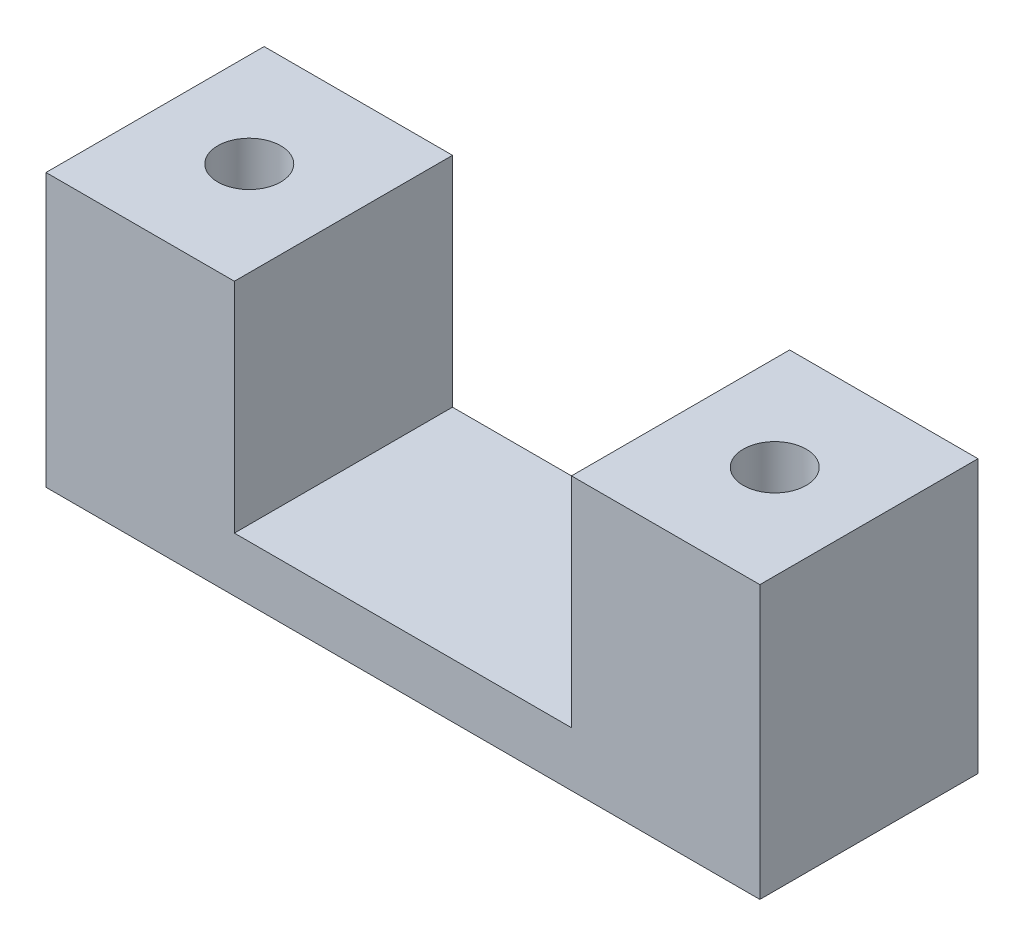
ISO-10303-21;
HEADER;
FILE_DESCRIPTION(('STEP AP214'),'2;1');
FILE_NAME('part.step','',(''),(''),'','','');
FILE_SCHEMA(('AUTOMOTIVE_DESIGN { 1 0 10303 214 1 1 1 1 }'));
ENDSEC;
DATA;
#1=APPLICATION_CONTEXT('core data for automotive mechanical design processes');
#2=APPLICATION_PROTOCOL_DEFINITION('international standard','automotive_design',2000,#1);
#3=PRODUCT_CONTEXT('',#1,'mechanical');
#4=PRODUCT('Part','Part','',(#3));
#5=PRODUCT_RELATED_PRODUCT_CATEGORY('part','',(#4));
#6=PRODUCT_DEFINITION_FORMATION('','',#4);
#7=PRODUCT_DEFINITION_CONTEXT('part definition',#1,'design');
#8=PRODUCT_DEFINITION('design','',#6,#7);
#9=PRODUCT_DEFINITION_SHAPE('','',#8);
#10=(LENGTH_UNIT() NAMED_UNIT(*) SI_UNIT(.MILLI.,.METRE.));
#11=(NAMED_UNIT(*) PLANE_ANGLE_UNIT() SI_UNIT($,.RADIAN.));
#12=(NAMED_UNIT(*) SI_UNIT($,.STERADIAN.) SOLID_ANGLE_UNIT());
#13=UNCERTAINTY_MEASURE_WITH_UNIT(LENGTH_MEASURE(1.E-05),#10,'distance_accuracy_value','');
#14=(GEOMETRIC_REPRESENTATION_CONTEXT(3) GLOBAL_UNCERTAINTY_ASSIGNED_CONTEXT((#13)) GLOBAL_UNIT_ASSIGNED_CONTEXT((#10,
#11,#12)) REPRESENTATION_CONTEXT('',''));
#15=CARTESIAN_POINT('',(0.,0.,0.));
#16=DIRECTION('',(0.,0.,1.));
#17=DIRECTION('',(1.,0.,0.));
#18=AXIS2_PLACEMENT_3D('',#15,#16,#17);
#19=CARTESIAN_POINT('',(9.49999999999999,-41.5,-11.));
#20=DIRECTION('',(0.,1.,0.));
#21=DIRECTION('',(0.,0.,1.));
#22=AXIS2_PLACEMENT_3D('',#19,#20,#21);
#23=CYLINDRICAL_SURFACE('',#22,3.175);
#24=CARTESIAN_POINT('',(9.49999999999999,27.5,-11.));
#25=DIRECTION('',(0.,1.,0.));
#26=DIRECTION('',(0.,0.,1.));
#27=AXIS2_PLACEMENT_3D('',#24,#25,#26);
#28=CIRCLE('',#27,3.175);
#29=CARTESIAN_POINT('',(9.49999999999999,27.5,-7.825));
#30=VERTEX_POINT('',#29);
#31=EDGE_CURVE('E139',#30,#30,#28,.T.);
#32=ORIENTED_EDGE('',*,*,#31,.T.);
#33=EDGE_LOOP('',(#32));
#34=FACE_BOUND('',#33,.T.);
#35=CARTESIAN_POINT('',(9.49999999999999,5.5,-11.));
#36=DIRECTION('',(0.,-1.,0.));
#37=DIRECTION('',(0.,0.,-1.));
#38=AXIS2_PLACEMENT_3D('',#35,#36,#37);
#39=CIRCLE('',#38,3.175);
#40=CARTESIAN_POINT('',(9.49999999999999,5.5,-14.175));
#41=VERTEX_POINT('',#40);
#42=EDGE_CURVE('E171',#41,#41,#39,.F.);
#43=ORIENTED_EDGE('',*,*,#42,.F.);
#44=EDGE_LOOP('',(#43));
#45=FACE_BOUND('',#44,.T.);
#46=ADVANCED_FACE('F34',(#34,#45),#23,.F.);
#47=CARTESIAN_POINT('',(0.,27.5,0.));
#48=DIRECTION('',(0.,1.,0.));
#49=DIRECTION('',(0.,0.,1.));
#50=AXIS2_PLACEMENT_3D('',#47,#48,#49);
#51=PLANE('',#50);
#52=CARTESIAN_POINT('',(62.5,27.5,-11.));
#53=DIRECTION('',(0.,1.,0.));
#54=DIRECTION('',(0.,0.,-1.));
#55=AXIS2_PLACEMENT_3D('',#52,#53,#54);
#56=CIRCLE('',#55,3.17500000000002);
#57=CARTESIAN_POINT('',(62.5,27.5,-14.175));
#58=VERTEX_POINT('',#57);
#59=EDGE_CURVE('E173',#58,#58,#56,.T.);
#60=ORIENTED_EDGE('',*,*,#59,.F.);
#61=EDGE_LOOP('',(#60));
#62=FACE_BOUND('',#61,.T.);
#63=DIRECTION('',(0.,0.,-1.));
#64=VECTOR('',#63,1.);
#65=CARTESIAN_POINT('',(53.,27.5,-22.));
#66=LINE('',#65,#64);
#67=CARTESIAN_POINT('',(53.,27.5,0.));
#68=VERTEX_POINT('',#67);
#69=CARTESIAN_POINT('',(53.,27.5,-22.));
#70=VERTEX_POINT('',#69);
#71=EDGE_CURVE('E115',#68,#70,#66,.T.);
#72=ORIENTED_EDGE('',*,*,#71,.F.);
#73=DIRECTION('',(1.,0.,0.));
#74=VECTOR('',#73,1.);
#75=CARTESIAN_POINT('',(0.,27.5,0.));
#76=LINE('',#75,#74);
#77=CARTESIAN_POINT('',(72.,27.5,0.));
#78=VERTEX_POINT('',#77);
#79=EDGE_CURVE('E87',#68,#78,#76,.T.);
#80=ORIENTED_EDGE('',*,*,#79,.T.);
#81=DIRECTION('',(0.,0.,-1.));
#82=VECTOR('',#81,1.);
#83=CARTESIAN_POINT('',(72.,27.5,0.));
#84=LINE('',#83,#82);
#85=CARTESIAN_POINT('',(72.,27.5,-22.));
#86=VERTEX_POINT('',#85);
#87=EDGE_CURVE('E151',#78,#86,#84,.T.);
#88=ORIENTED_EDGE('',*,*,#87,.T.);
#89=DIRECTION('',(1.,0.,0.));
#90=VECTOR('',#89,1.);
#91=CARTESIAN_POINT('',(0.,27.5,-22.));
#92=LINE('',#91,#90);
#93=EDGE_CURVE('E153',#70,#86,#92,.T.);
#94=ORIENTED_EDGE('',*,*,#93,.F.);
#95=EDGE_LOOP('',(#72,#80,#88,#94));
#96=FACE_BOUND('',#95,.T.);
#97=ADVANCED_FACE('F200',(#62,#96),#51,.T.);
#98=CARTESIAN_POINT('',(0.,27.5,0.));
#99=DIRECTION('',(0.,0.,-1.));
#100=DIRECTION('',(-1.,0.,0.));
#101=AXIS2_PLACEMENT_3D('',#98,#99,#100);
#102=PLANE('',#101);
#103=ORIENTED_EDGE('',*,*,#79,.F.);
#104=DIRECTION('',(0.,1.,0.));
#105=VECTOR('',#104,1.);
#106=CARTESIAN_POINT('',(53.,5.5,0.));
#107=LINE('',#106,#105);
#108=CARTESIAN_POINT('',(53.,5.5,0.));
#109=VERTEX_POINT('',#108);
#110=EDGE_CURVE('E141',#109,#68,#107,.T.);
#111=ORIENTED_EDGE('',*,*,#110,.F.);
#112=DIRECTION('',(1.,0.,0.));
#113=VECTOR('',#112,1.);
#114=CARTESIAN_POINT('',(19.,5.5,0.));
#115=LINE('',#114,#113);
#116=CARTESIAN_POINT('',(19.,5.5,0.));
#117=VERTEX_POINT('',#116);
#118=EDGE_CURVE('E119',#117,#109,#115,.T.);
#119=ORIENTED_EDGE('',*,*,#118,.F.);
#120=DIRECTION('',(0.,1.,0.));
#121=VECTOR('',#120,1.);
#122=CARTESIAN_POINT('',(19.,5.5,0.));
#123=LINE('',#122,#121);
#124=CARTESIAN_POINT('',(19.,27.5,0.));
#125=VERTEX_POINT('',#124);
#126=EDGE_CURVE('E144',#117,#125,#123,.T.);
#127=ORIENTED_EDGE('',*,*,#126,.T.);
#128=CARTESIAN_POINT('',(0.,27.5,0.));
#129=VERTEX_POINT('',#128);
#130=EDGE_CURVE('E148',#129,#125,#76,.T.);
#131=ORIENTED_EDGE('',*,*,#130,.F.);
#132=DIRECTION('',(0.,-1.,0.));
#133=VECTOR('',#132,1.);
#134=CARTESIAN_POINT('',(0.,27.5,0.));
#135=LINE('',#134,#133);
#136=CARTESIAN_POINT('',(0.,0.,0.));
#137=VERTEX_POINT('',#136);
#138=EDGE_CURVE('E60',#129,#137,#135,.T.);
#139=ORIENTED_EDGE('',*,*,#138,.T.);
#140=DIRECTION('',(1.,0.,0.));
#141=VECTOR('',#140,1.);
#142=CARTESIAN_POINT('',(0.,0.,0.));
#143=LINE('',#142,#141);
#144=CARTESIAN_POINT('',(72.,0.,0.));
#145=VERTEX_POINT('',#144);
#146=EDGE_CURVE('E143',#137,#145,#143,.T.);
#147=ORIENTED_EDGE('',*,*,#146,.T.);
#148=DIRECTION('',(0.,-1.,0.));
#149=VECTOR('',#148,1.);
#150=CARTESIAN_POINT('',(72.,27.5,0.));
#151=LINE('',#150,#149);
#152=EDGE_CURVE('E11',#78,#145,#151,.T.);
#153=ORIENTED_EDGE('',*,*,#152,.F.);
#154=EDGE_LOOP('',(#103,#111,#119,#127,#131,#139,#147,#153));
#155=FACE_BOUND('',#154,.T.);
#156=ADVANCED_FACE('F36',(#155),#102,.F.);
#157=CARTESIAN_POINT('',(72.,27.5,0.));
#158=DIRECTION('',(-1.,0.,0.));
#159=DIRECTION('',(0.,0.,1.));
#160=AXIS2_PLACEMENT_3D('',#157,#158,#159);
#161=PLANE('',#160);
#162=DIRECTION('',(0.,0.,-1.));
#163=VECTOR('',#162,1.);
#164=CARTESIAN_POINT('',(72.,0.,0.));
#165=LINE('',#164,#163);
#166=CARTESIAN_POINT('',(72.,0.,-22.));
#167=VERTEX_POINT('',#166);
#168=EDGE_CURVE('E159',#145,#167,#165,.T.);
#169=ORIENTED_EDGE('',*,*,#168,.T.);
#170=DIRECTION('',(0.,-1.,0.));
#171=VECTOR('',#170,1.);
#172=CARTESIAN_POINT('',(72.,27.5,-22.));
#173=LINE('',#172,#171);
#174=EDGE_CURVE('E43',#86,#167,#173,.T.);
#175=ORIENTED_EDGE('',*,*,#174,.F.);
#176=ORIENTED_EDGE('',*,*,#87,.F.);
#177=ORIENTED_EDGE('',*,*,#152,.T.);
#178=EDGE_LOOP('',(#169,#175,#176,#177));
#179=FACE_BOUND('',#178,.T.);
#180=ADVANCED_FACE('F207',(#179),#161,.F.);
#181=CARTESIAN_POINT('',(0.,27.5,-22.));
#182=DIRECTION('',(0.,0.,-1.));
#183=DIRECTION('',(-1.,0.,0.));
#184=AXIS2_PLACEMENT_3D('',#181,#182,#183);
#185=PLANE('',#184);
#186=DIRECTION('',(0.,1.,0.));
#187=VECTOR('',#186,1.);
#188=CARTESIAN_POINT('',(53.,5.5,-22.));
#189=LINE('',#188,#187);
#190=CARTESIAN_POINT('',(53.,5.5,-22.));
#191=VERTEX_POINT('',#190);
#192=EDGE_CURVE('E110',#191,#70,#189,.T.);
#193=ORIENTED_EDGE('',*,*,#192,.T.);
#194=ORIENTED_EDGE('',*,*,#93,.T.);
#195=ORIENTED_EDGE('',*,*,#174,.T.);
#196=DIRECTION('',(1.,0.,0.));
#197=VECTOR('',#196,1.);
#198=CARTESIAN_POINT('',(0.,0.,-22.));
#199=LINE('',#198,#197);
#200=CARTESIAN_POINT('',(0.,0.,-22.));
#201=VERTEX_POINT('',#200);
#202=EDGE_CURVE('E162',#201,#167,#199,.T.);
#203=ORIENTED_EDGE('',*,*,#202,.F.);
#204=DIRECTION('',(0.,-1.,0.));
#205=VECTOR('',#204,1.);
#206=CARTESIAN_POINT('',(0.,27.5,-22.));
#207=LINE('',#206,#205);
#208=CARTESIAN_POINT('',(0.,27.5,-22.));
#209=VERTEX_POINT('',#208);
#210=EDGE_CURVE('E169',#209,#201,#207,.T.);
#211=ORIENTED_EDGE('',*,*,#210,.F.);
#212=CARTESIAN_POINT('',(19.,27.5,-22.));
#213=VERTEX_POINT('',#212);
#214=EDGE_CURVE('E154',#209,#213,#92,.T.);
#215=ORIENTED_EDGE('',*,*,#214,.T.);
#216=DIRECTION('',(0.,1.,0.));
#217=VECTOR('',#216,1.);
#218=CARTESIAN_POINT('',(19.,5.5,-22.));
#219=LINE('',#218,#217);
#220=CARTESIAN_POINT('',(19.,5.5,-22.));
#221=VERTEX_POINT('',#220);
#222=EDGE_CURVE('E51',#221,#213,#219,.T.);
#223=ORIENTED_EDGE('',*,*,#222,.F.);
#224=DIRECTION('',(-1.,0.,0.));
#225=VECTOR('',#224,1.);
#226=CARTESIAN_POINT('',(19.,5.5,-22.));
#227=LINE('',#226,#225);
#228=EDGE_CURVE('E125',#191,#221,#227,.T.);
#229=ORIENTED_EDGE('',*,*,#228,.F.);
#230=EDGE_LOOP('',(#193,#194,#195,#203,#211,#215,#223,#229));
#231=FACE_BOUND('',#230,.T.);
#232=ADVANCED_FACE('F130',(#231),#185,.T.);
#233=CARTESIAN_POINT('',(0.,27.5,0.));
#234=DIRECTION('',(-1.,0.,0.));
#235=DIRECTION('',(0.,0.,1.));
#236=AXIS2_PLACEMENT_3D('',#233,#234,#235);
#237=PLANE('',#236);
#238=DIRECTION('',(0.,0.,-1.));
#239=VECTOR('',#238,1.);
#240=CARTESIAN_POINT('',(0.,0.,0.));
#241=LINE('',#240,#239);
#242=EDGE_CURVE('E165',#137,#201,#241,.T.);
#243=ORIENTED_EDGE('',*,*,#242,.F.);
#244=ORIENTED_EDGE('',*,*,#138,.F.);
#245=DIRECTION('',(0.,0.,-1.));
#246=VECTOR('',#245,1.);
#247=CARTESIAN_POINT('',(0.,27.5,0.));
#248=LINE('',#247,#246);
#249=EDGE_CURVE('E156',#129,#209,#248,.T.);
#250=ORIENTED_EDGE('',*,*,#249,.T.);
#251=ORIENTED_EDGE('',*,*,#210,.T.);
#252=EDGE_LOOP('',(#243,#244,#250,#251));
#253=FACE_BOUND('',#252,.T.);
#254=ADVANCED_FACE('F198',(#253),#237,.T.);
#255=ORIENTED_EDGE('',*,*,#31,.F.);
#256=EDGE_LOOP('',(#255));
#257=FACE_BOUND('',#256,.T.);
#258=DIRECTION('',(0.,0.,1.));
#259=VECTOR('',#258,1.);
#260=CARTESIAN_POINT('',(19.,27.5,-22.));
#261=LINE('',#260,#259);
#262=EDGE_CURVE('E128',#213,#125,#261,.T.);
#263=ORIENTED_EDGE('',*,*,#262,.F.);
#264=ORIENTED_EDGE('',*,*,#214,.F.);
#265=ORIENTED_EDGE('',*,*,#249,.F.);
#266=ORIENTED_EDGE('',*,*,#130,.T.);
#267=EDGE_LOOP('',(#263,#264,#265,#266));
#268=FACE_BOUND('',#267,.T.);
#269=ADVANCED_FACE('F194',(#257,#268),#51,.T.);
#270=CARTESIAN_POINT('',(0.,0.,0.));
#271=DIRECTION('',(0.,1.,0.));
#272=DIRECTION('',(0.,0.,1.));
#273=AXIS2_PLACEMENT_3D('',#270,#271,#272);
#274=PLANE('',#273);
#275=CARTESIAN_POINT('',(62.5,0.,-11.));
#276=DIRECTION('',(0.,-1.,0.));
#277=DIRECTION('',(0.,0.,1.));
#278=AXIS2_PLACEMENT_3D('',#275,#276,#277);
#279=CIRCLE('',#278,5.50000000000001);
#280=CARTESIAN_POINT('',(62.5,0.,-5.49999999999999));
#281=VERTEX_POINT('',#280);
#282=EDGE_CURVE('E187',#281,#281,#279,.T.);
#283=ORIENTED_EDGE('',*,*,#282,.F.);
#284=EDGE_LOOP('',(#283));
#285=FACE_BOUND('',#284,.T.);
#286=CARTESIAN_POINT('',(9.49999999999999,0.,-11.));
#287=DIRECTION('',(0.,-1.,0.));
#288=DIRECTION('',(0.,0.,-1.));
#289=AXIS2_PLACEMENT_3D('',#286,#287,#288);
#290=CIRCLE('',#289,5.5);
#291=CARTESIAN_POINT('',(9.49999999999999,0.,-16.5));
#292=VERTEX_POINT('',#291);
#293=EDGE_CURVE('E180',#292,#292,#290,.T.);
#294=ORIENTED_EDGE('',*,*,#293,.F.);
#295=EDGE_LOOP('',(#294));
#296=FACE_BOUND('',#295,.T.);
#297=ORIENTED_EDGE('',*,*,#146,.F.);
#298=ORIENTED_EDGE('',*,*,#242,.T.);
#299=ORIENTED_EDGE('',*,*,#202,.T.);
#300=ORIENTED_EDGE('',*,*,#168,.F.);
#301=EDGE_LOOP('',(#297,#298,#299,#300));
#302=FACE_BOUND('',#301,.T.);
#303=ADVANCED_FACE('F197',(#285,#296,#302),#274,.F.);
#304=CARTESIAN_POINT('',(53.,5.5,-22.));
#305=DIRECTION('',(1.,0.,0.));
#306=DIRECTION('',(0.,0.,-1.));
#307=AXIS2_PLACEMENT_3D('',#304,#305,#306);
#308=PLANE('',#307);
#309=ORIENTED_EDGE('',*,*,#71,.T.);
#310=ORIENTED_EDGE('',*,*,#192,.F.);
#311=DIRECTION('',(0.,0.,-1.));
#312=VECTOR('',#311,1.);
#313=CARTESIAN_POINT('',(53.,5.5,-22.));
#314=LINE('',#313,#312);
#315=EDGE_CURVE('E113',#109,#191,#314,.T.);
#316=ORIENTED_EDGE('',*,*,#315,.F.);
#317=ORIENTED_EDGE('',*,*,#110,.T.);
#318=EDGE_LOOP('',(#309,#310,#316,#317));
#319=FACE_BOUND('',#318,.T.);
#320=ADVANCED_FACE('F112',(#319),#308,.F.);
#321=CARTESIAN_POINT('',(19.,5.5,-22.));
#322=DIRECTION('',(-1.,0.,0.));
#323=DIRECTION('',(0.,0.,1.));
#324=AXIS2_PLACEMENT_3D('',#321,#322,#323);
#325=PLANE('',#324);
#326=ORIENTED_EDGE('',*,*,#262,.T.);
#327=ORIENTED_EDGE('',*,*,#126,.F.);
#328=DIRECTION('',(0.,0.,1.));
#329=VECTOR('',#328,1.);
#330=CARTESIAN_POINT('',(19.,5.5,-22.));
#331=LINE('',#330,#329);
#332=EDGE_CURVE('E132',#221,#117,#331,.T.);
#333=ORIENTED_EDGE('',*,*,#332,.F.);
#334=ORIENTED_EDGE('',*,*,#222,.T.);
#335=EDGE_LOOP('',(#326,#327,#333,#334));
#336=FACE_BOUND('',#335,.T.);
#337=ADVANCED_FACE('F255',(#336),#325,.F.);
#338=CARTESIAN_POINT('',(0.,5.5,0.));
#339=DIRECTION('',(0.,1.,0.));
#340=DIRECTION('',(0.,0.,1.));
#341=AXIS2_PLACEMENT_3D('',#338,#339,#340);
#342=PLANE('',#341);
#343=ORIENTED_EDGE('',*,*,#315,.T.);
#344=ORIENTED_EDGE('',*,*,#228,.T.);
#345=ORIENTED_EDGE('',*,*,#332,.T.);
#346=ORIENTED_EDGE('',*,*,#118,.T.);
#347=EDGE_LOOP('',(#343,#344,#345,#346));
#348=FACE_BOUND('',#347,.T.);
#349=ADVANCED_FACE('F123',(#348),#342,.T.);
#350=CARTESIAN_POINT('',(62.5,-41.5,-11.));
#351=DIRECTION('',(0.,1.,0.));
#352=DIRECTION('',(0.,0.,1.));
#353=AXIS2_PLACEMENT_3D('',#350,#351,#352);
#354=CYLINDRICAL_SURFACE('',#353,3.17500000000002);
#355=CARTESIAN_POINT('',(62.5,5.5,-11.));
#356=DIRECTION('',(0.,1.,0.));
#357=DIRECTION('',(0.,0.,1.));
#358=AXIS2_PLACEMENT_3D('',#355,#356,#357);
#359=CIRCLE('',#358,3.17500000000002);
#360=CARTESIAN_POINT('',(62.5,5.5,-7.82499999999999));
#361=VERTEX_POINT('',#360);
#362=EDGE_CURVE('E38',#361,#361,#359,.F.);
#363=ORIENTED_EDGE('',*,*,#362,.T.);
#364=EDGE_LOOP('',(#363));
#365=FACE_BOUND('',#364,.T.);
#366=ORIENTED_EDGE('',*,*,#59,.T.);
#367=EDGE_LOOP('',(#366));
#368=FACE_BOUND('',#367,.T.);
#369=ADVANCED_FACE('F266',(#365,#368),#354,.F.);
#370=CARTESIAN_POINT('',(9.49999999999999,5.5,-11.));
#371=DIRECTION('',(0.,-1.,0.));
#372=DIRECTION('',(0.,0.,-1.));
#373=AXIS2_PLACEMENT_3D('',#370,#371,#372);
#374=PLANE('',#373);
#375=CARTESIAN_POINT('',(9.49999999999999,5.5,-11.));
#376=DIRECTION('',(0.,-1.,0.));
#377=DIRECTION('',(0.,0.,-1.));
#378=AXIS2_PLACEMENT_3D('',#375,#376,#377);
#379=CIRCLE('',#378,5.5);
#380=CARTESIAN_POINT('',(9.49999999999999,5.5,-16.5));
#381=VERTEX_POINT('',#380);
#382=EDGE_CURVE('E174',#381,#381,#379,.T.);
#383=ORIENTED_EDGE('',*,*,#382,.T.);
#384=EDGE_LOOP('',(#383));
#385=FACE_BOUND('',#384,.T.);
#386=ORIENTED_EDGE('',*,*,#42,.T.);
#387=EDGE_LOOP('',(#386));
#388=FACE_BOUND('',#387,.T.);
#389=ADVANCED_FACE('F272',(#385,#388),#374,.T.);
#390=CARTESIAN_POINT('',(9.49999999999999,5.5,-11.));
#391=DIRECTION('',(0.,-1.,0.));
#392=DIRECTION('',(0.,0.,-1.));
#393=AXIS2_PLACEMENT_3D('',#390,#391,#392);
#394=CYLINDRICAL_SURFACE('',#393,5.5);
#395=ORIENTED_EDGE('',*,*,#382,.F.);
#396=EDGE_LOOP('',(#395));
#397=FACE_BOUND('',#396,.T.);
#398=ORIENTED_EDGE('',*,*,#293,.T.);
#399=EDGE_LOOP('',(#398));
#400=FACE_BOUND('',#399,.T.);
#401=ADVANCED_FACE('F280',(#397,#400),#394,.F.);
#402=CARTESIAN_POINT('',(62.5,5.5,-11.));
#403=DIRECTION('',(0.,1.,0.));
#404=DIRECTION('',(0.,0.,1.));
#405=AXIS2_PLACEMENT_3D('',#402,#403,#404);
#406=PLANE('',#405);
#407=CARTESIAN_POINT('',(62.5,5.5,-11.));
#408=DIRECTION('',(0.,-1.,0.));
#409=DIRECTION('',(0.,0.,1.));
#410=AXIS2_PLACEMENT_3D('',#407,#408,#409);
#411=CIRCLE('',#410,5.50000000000001);
#412=CARTESIAN_POINT('',(62.5,5.5,-5.49999999999999));
#413=VERTEX_POINT('',#412);
#414=EDGE_CURVE('E348',#413,#413,#411,.T.);
#415=ORIENTED_EDGE('',*,*,#414,.T.);
#416=EDGE_LOOP('',(#415));
#417=FACE_BOUND('',#416,.T.);
#418=ORIENTED_EDGE('',*,*,#362,.F.);
#419=EDGE_LOOP('',(#418));
#420=FACE_BOUND('',#419,.T.);
#421=ADVANCED_FACE('F287',(#417,#420),#406,.F.);
#422=CARTESIAN_POINT('',(62.5,5.5,-11.));
#423=DIRECTION('',(0.,-1.,0.));
#424=DIRECTION('',(0.,0.,-1.));
#425=AXIS2_PLACEMENT_3D('',#422,#423,#424);
#426=CYLINDRICAL_SURFACE('',#425,5.50000000000001);
#427=ORIENTED_EDGE('',*,*,#414,.F.);
#428=EDGE_LOOP('',(#427));
#429=FACE_BOUND('',#428,.T.);
#430=ORIENTED_EDGE('',*,*,#282,.T.);
#431=EDGE_LOOP('',(#430));
#432=FACE_BOUND('',#431,.T.);
#433=ADVANCED_FACE('F295',(#429,#432),#426,.F.);
#434=CLOSED_SHELL('',(#46,#97,#156,#180,#232,#254,#269,#303,#320,#337,#349,#369,#389,#401,#421,#433));
#435=MANIFOLD_SOLID_BREP('B2',#434);
#436=ADVANCED_BREP_SHAPE_REPRESENTATION('',(#18,#435),#14);
#437=SHAPE_DEFINITION_REPRESENTATION(#9,#436);
ENDSEC;
END-ISO-10303-21;
